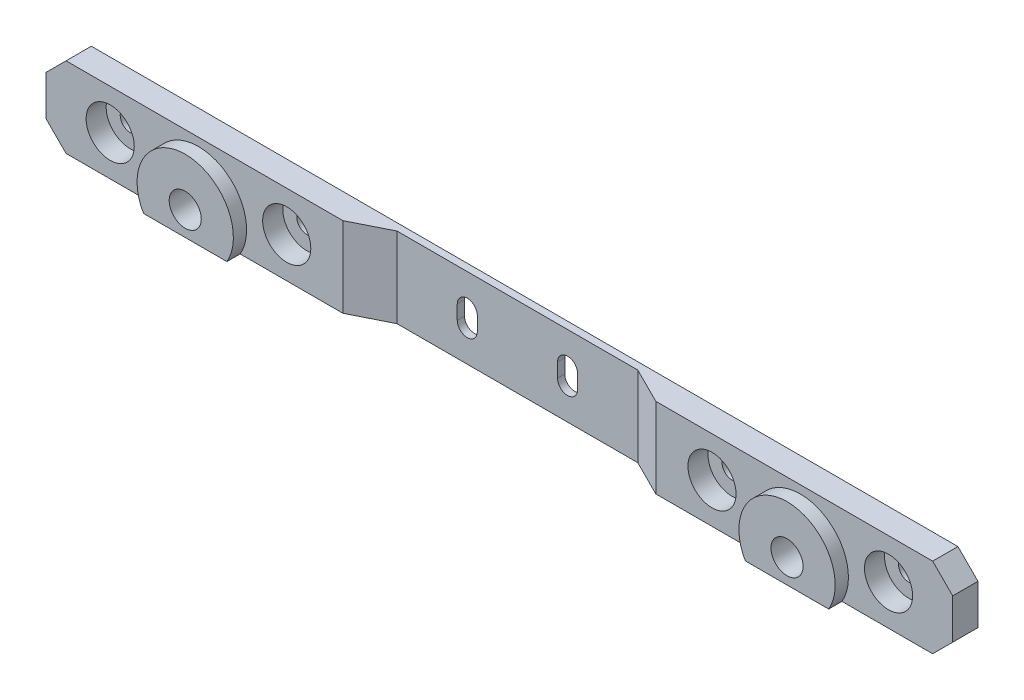
ISO-10303-21;
HEADER;
FILE_DESCRIPTION(('STEP AP214'),'2;1');
FILE_NAME('part.step','',(''),(''),'','','');
FILE_SCHEMA(('AUTOMOTIVE_DESIGN { 1 0 10303 214 1 1 1 1 }'));
ENDSEC;
DATA;
#1=APPLICATION_CONTEXT('core data for automotive mechanical design processes');
#2=APPLICATION_PROTOCOL_DEFINITION('international standard','automotive_design',2000,#1);
#3=PRODUCT_CONTEXT('',#1,'mechanical');
#4=PRODUCT('Part','Part','',(#3));
#5=PRODUCT_RELATED_PRODUCT_CATEGORY('part','',(#4));
#6=PRODUCT_DEFINITION_FORMATION('','',#4);
#7=PRODUCT_DEFINITION_CONTEXT('part definition',#1,'design');
#8=PRODUCT_DEFINITION('design','',#6,#7);
#9=PRODUCT_DEFINITION_SHAPE('','',#8);
#10=(LENGTH_UNIT() NAMED_UNIT(*) SI_UNIT(.MILLI.,.METRE.));
#11=(NAMED_UNIT(*) PLANE_ANGLE_UNIT() SI_UNIT($,.RADIAN.));
#12=(NAMED_UNIT(*) SI_UNIT($,.STERADIAN.) SOLID_ANGLE_UNIT());
#13=UNCERTAINTY_MEASURE_WITH_UNIT(LENGTH_MEASURE(1.E-05),#10,'distance_accuracy_value','');
#14=(GEOMETRIC_REPRESENTATION_CONTEXT(3) GLOBAL_UNCERTAINTY_ASSIGNED_CONTEXT((#13)) GLOBAL_UNIT_ASSIGNED_CONTEXT((#10,
#11,#12)) REPRESENTATION_CONTEXT('',''));
#15=CARTESIAN_POINT('',(0.,0.,0.));
#16=DIRECTION('',(0.,0.,1.));
#17=DIRECTION('',(1.,0.,0.));
#18=AXIS2_PLACEMENT_3D('',#15,#16,#17);
#19=CARTESIAN_POINT('',(166.,-10.,9.6));
#20=DIRECTION('',(0.,0.,-1.));
#21=DIRECTION('',(-1.,0.,0.));
#22=AXIS2_PLACEMENT_3D('',#19,#20,#21);
#23=CYLINDRICAL_SURFACE('',#22,2.5);
#24=CARTESIAN_POINT('',(166.,-10.,0.));
#25=DIRECTION('',(0.,0.,1.));
#26=DIRECTION('',(1.,0.,0.));
#27=AXIS2_PLACEMENT_3D('',#24,#25,#26);
#28=CIRCLE('',#27,2.5);
#29=CARTESIAN_POINT('',(168.5,-10.,0.));
#30=VERTEX_POINT('',#29);
#31=EDGE_CURVE('E426',#30,#30,#28,.F.);
#32=ORIENTED_EDGE('',*,*,#31,.T.);
#33=EDGE_LOOP('',(#32));
#34=FACE_BOUND('',#33,.T.);
#35=CARTESIAN_POINT('',(166.,-10.,1.3));
#36=DIRECTION('',(0.,0.,1.));
#37=DIRECTION('',(1.,0.,0.));
#38=AXIS2_PLACEMENT_3D('',#35,#36,#37);
#39=CIRCLE('',#38,2.5);
#40=CARTESIAN_POINT('',(168.5,-10.,1.3));
#41=VERTEX_POINT('',#40);
#42=EDGE_CURVE('E45',#41,#41,#39,.F.);
#43=ORIENTED_EDGE('',*,*,#42,.F.);
#44=EDGE_LOOP('',(#43));
#45=FACE_BOUND('',#44,.T.);
#46=ADVANCED_FACE('F41',(#34,#45),#23,.F.);
#47=CARTESIAN_POINT('',(60.,-10.,9.6));
#48=DIRECTION('',(0.,0.,-1.));
#49=DIRECTION('',(-1.,0.,0.));
#50=AXIS2_PLACEMENT_3D('',#47,#48,#49);
#51=CYLINDRICAL_SURFACE('',#50,2.5);
#52=CARTESIAN_POINT('',(60.,-10.,0.));
#53=DIRECTION('',(0.,0.,1.));
#54=DIRECTION('',(1.,0.,0.));
#55=AXIS2_PLACEMENT_3D('',#52,#53,#54);
#56=CIRCLE('',#55,2.5);
#57=CARTESIAN_POINT('',(62.5,-10.,0.));
#58=VERTEX_POINT('',#57);
#59=EDGE_CURVE('E422',#58,#58,#56,.T.);
#60=ORIENTED_EDGE('',*,*,#59,.F.);
#61=EDGE_LOOP('',(#60));
#62=FACE_BOUND('',#61,.T.);
#63=CARTESIAN_POINT('',(60.,-10.,1.3));
#64=DIRECTION('',(0.,0.,1.));
#65=DIRECTION('',(1.,0.,0.));
#66=AXIS2_PLACEMENT_3D('',#63,#64,#65);
#67=CIRCLE('',#66,2.5);
#68=CARTESIAN_POINT('',(62.5,-10.,1.3));
#69=VERTEX_POINT('',#68);
#70=EDGE_CURVE('E491',#69,#69,#67,.T.);
#71=ORIENTED_EDGE('',*,*,#70,.T.);
#72=EDGE_LOOP('',(#71));
#73=FACE_BOUND('',#72,.T.);
#74=ADVANCED_FACE('F503',(#62,#73),#51,.F.);
#75=CARTESIAN_POINT('',(16.,-10.,9.6));
#76=DIRECTION('',(0.,0.,-1.));
#77=DIRECTION('',(-1.,0.,0.));
#78=AXIS2_PLACEMENT_3D('',#75,#76,#77);
#79=CYLINDRICAL_SURFACE('',#78,2.5);
#80=CARTESIAN_POINT('',(16.,-10.,0.));
#81=DIRECTION('',(0.,0.,1.));
#82=DIRECTION('',(1.,0.,0.));
#83=AXIS2_PLACEMENT_3D('',#80,#81,#82);
#84=CIRCLE('',#83,2.5);
#85=CARTESIAN_POINT('',(18.5,-10.,0.));
#86=VERTEX_POINT('',#85);
#87=EDGE_CURVE('E418',#86,#86,#84,.T.);
#88=ORIENTED_EDGE('',*,*,#87,.F.);
#89=EDGE_LOOP('',(#88));
#90=FACE_BOUND('',#89,.T.);
#91=CARTESIAN_POINT('',(16.,-10.,1.3));
#92=DIRECTION('',(0.,0.,1.));
#93=DIRECTION('',(1.,0.,0.));
#94=AXIS2_PLACEMENT_3D('',#91,#92,#93);
#95=CIRCLE('',#94,2.5);
#96=CARTESIAN_POINT('',(18.5,-10.,1.3));
#97=VERTEX_POINT('',#96);
#98=EDGE_CURVE('E487',#97,#97,#95,.T.);
#99=ORIENTED_EDGE('',*,*,#98,.T.);
#100=EDGE_LOOP('',(#99));
#101=FACE_BOUND('',#100,.T.);
#102=ADVANCED_FACE('F509',(#90,#101),#79,.F.);
#103=CARTESIAN_POINT('',(210.,-10.,9.6));
#104=DIRECTION('',(0.,0.,-1.));
#105=DIRECTION('',(-1.,0.,0.));
#106=AXIS2_PLACEMENT_3D('',#103,#104,#105);
#107=CYLINDRICAL_SURFACE('',#106,2.5);
#108=CARTESIAN_POINT('',(210.,-10.,0.));
#109=DIRECTION('',(0.,0.,1.));
#110=DIRECTION('',(1.,0.,0.));
#111=AXIS2_PLACEMENT_3D('',#108,#109,#110);
#112=CIRCLE('',#111,2.5);
#113=CARTESIAN_POINT('',(212.5,-10.,0.));
#114=VERTEX_POINT('',#113);
#115=EDGE_CURVE('E382',#114,#114,#112,.F.);
#116=ORIENTED_EDGE('',*,*,#115,.T.);
#117=EDGE_LOOP('',(#116));
#118=FACE_BOUND('',#117,.T.);
#119=CARTESIAN_POINT('',(210.,-10.,1.3));
#120=DIRECTION('',(0.,0.,1.));
#121=DIRECTION('',(1.,0.,0.));
#122=AXIS2_PLACEMENT_3D('',#119,#120,#121);
#123=CIRCLE('',#122,2.5);
#124=CARTESIAN_POINT('',(212.5,-10.,1.3));
#125=VERTEX_POINT('',#124);
#126=EDGE_CURVE('E483',#125,#125,#123,.F.);
#127=ORIENTED_EDGE('',*,*,#126,.F.);
#128=EDGE_LOOP('',(#127));
#129=FACE_BOUND('',#128,.T.);
#130=ADVANCED_FACE('F518',(#118,#129),#107,.F.);
#131=CARTESIAN_POINT('',(0.,0.,6.3));
#132=DIRECTION('',(0.,0.,1.));
#133=DIRECTION('',(1.,0.,0.));
#134=AXIS2_PLACEMENT_3D('',#131,#132,#133);
#135=PLANE('',#134);
#136=CARTESIAN_POINT('',(166.,-10.,6.3));
#137=DIRECTION('',(0.,0.,1.));
#138=DIRECTION('',(1.,0.,0.));
#139=AXIS2_PLACEMENT_3D('',#136,#137,#138);
#140=CIRCLE('',#139,6.00000000000002);
#141=CARTESIAN_POINT('',(172.,-10.,6.3));
#142=VERTEX_POINT('',#141);
#143=EDGE_CURVE('E706',#142,#142,#140,.T.);
#144=ORIENTED_EDGE('',*,*,#143,.F.);
#145=EDGE_LOOP('',(#144));
#146=FACE_BOUND('',#145,.T.);
#147=CARTESIAN_POINT('',(210.,-10.,6.3));
#148=DIRECTION('',(0.,0.,1.));
#149=DIRECTION('',(1.,0.,0.));
#150=AXIS2_PLACEMENT_3D('',#147,#148,#149);
#151=CIRCLE('',#150,6.00000000000002);
#152=CARTESIAN_POINT('',(216.,-10.,6.3));
#153=VERTEX_POINT('',#152);
#154=EDGE_CURVE('E237',#153,#153,#151,.T.);
#155=ORIENTED_EDGE('',*,*,#154,.F.);
#156=EDGE_LOOP('',(#155));
#157=FACE_BOUND('',#156,.T.);
#158=DIRECTION('',(-1.,0.,0.));
#159=VECTOR('',#158,1.);
#160=CARTESIAN_POINT('',(0.,0.,6.3));
#161=LINE('',#160,#159);
#162=CARTESIAN_POINT('',(221.,0.,6.3));
#163=VERTEX_POINT('',#162);
#164=CARTESIAN_POINT('',(152.,0.,6.3));
#165=VERTEX_POINT('',#164);
#166=EDGE_CURVE('E300',#163,#165,#161,.T.);
#167=ORIENTED_EDGE('',*,*,#166,.T.);
#168=DIRECTION('',(0.,-1.,0.));
#169=VECTOR('',#168,1.);
#170=CARTESIAN_POINT('',(152.,0.,6.3));
#171=LINE('',#170,#169);
#172=CARTESIAN_POINT('',(152.,-20.,6.3));
#173=VERTEX_POINT('',#172);
#174=EDGE_CURVE('E209',#165,#173,#171,.T.);
#175=ORIENTED_EDGE('',*,*,#174,.T.);
#176=DIRECTION('',(1.,0.,0.));
#177=VECTOR('',#176,1.);
#178=CARTESIAN_POINT('',(0.,-20.,6.3));
#179=LINE('',#178,#177);
#180=CARTESIAN_POINT('',(177.607695154587,-20.,6.3));
#181=VERTEX_POINT('',#180);
#182=EDGE_CURVE('E282',#173,#181,#179,.T.);
#183=ORIENTED_EDGE('',*,*,#182,.T.);
#184=CARTESIAN_POINT('',(188.,-14.,6.3));
#185=DIRECTION('',(0.,0.,1.));
#186=DIRECTION('',(1.,0.,0.));
#187=AXIS2_PLACEMENT_3D('',#184,#185,#186);
#188=CIRCLE('',#187,12.);
#189=CARTESIAN_POINT('',(198.392304845413,-20.,6.3));
#190=VERTEX_POINT('',#189);
#191=EDGE_CURVE('E281',#181,#190,#188,.F.);
#192=ORIENTED_EDGE('',*,*,#191,.T.);
#193=DIRECTION('',(1.,0.,0.));
#194=VECTOR('',#193,1.);
#195=CARTESIAN_POINT('',(0.,-20.,6.3));
#196=LINE('',#195,#194);
#197=CARTESIAN_POINT('',(221.,-20.,6.3));
#198=VERTEX_POINT('',#197);
#199=EDGE_CURVE('E287',#190,#198,#196,.T.);
#200=ORIENTED_EDGE('',*,*,#199,.T.);
#201=DIRECTION('',(0.707106781186548,0.707106781186547,0.));
#202=VECTOR('',#201,1.);
#203=CARTESIAN_POINT('',(120.5,-120.5,6.3));
#204=LINE('',#203,#202);
#205=CARTESIAN_POINT('',(226.,-15.,6.3));
#206=VERTEX_POINT('',#205);
#207=EDGE_CURVE('E290',#198,#206,#204,.T.);
#208=ORIENTED_EDGE('',*,*,#207,.T.);
#209=DIRECTION('',(0.,1.,0.));
#210=VECTOR('',#209,1.);
#211=CARTESIAN_POINT('',(226.,0.,6.3));
#212=LINE('',#211,#210);
#213=CARTESIAN_POINT('',(226.,-5.00000000000004,6.3));
#214=VERTEX_POINT('',#213);
#215=EDGE_CURVE('E293',#206,#214,#212,.T.);
#216=ORIENTED_EDGE('',*,*,#215,.T.);
#217=DIRECTION('',(-0.707106781186548,0.707106781186547,0.));
#218=VECTOR('',#217,1.);
#219=CARTESIAN_POINT('',(110.5,110.5,6.3));
#220=LINE('',#219,#218);
#221=EDGE_CURVE('E296',#214,#163,#220,.T.);
#222=ORIENTED_EDGE('',*,*,#221,.T.);
#223=EDGE_LOOP('',(#167,#175,#183,#192,#200,#208,#216,#222));
#224=FACE_BOUND('',#223,.T.);
#225=ADVANCED_FACE('F552',(#146,#157,#224),#135,.T.);
#226=CARTESIAN_POINT('',(110.5,110.5,9.6));
#227=DIRECTION('',(0.707106781186547,0.707106781186548,0.));
#228=DIRECTION('',(-0.707106781186548,0.707106781186547,0.));
#229=AXIS2_PLACEMENT_3D('',#226,#227,#228);
#230=PLANE('',#229);
#231=DIRECTION('',(0.,0.,-1.));
#232=VECTOR('',#231,1.);
#233=CARTESIAN_POINT('',(221.,0.,9.6));
#234=LINE('',#233,#232);
#235=CARTESIAN_POINT('',(221.,0.,0.));
#236=VERTEX_POINT('',#235);
#237=EDGE_CURVE('E51',#163,#236,#234,.T.);
#238=ORIENTED_EDGE('',*,*,#237,.F.);
#239=ORIENTED_EDGE('',*,*,#221,.F.);
#240=DIRECTION('',(0.,0.,-1.));
#241=VECTOR('',#240,1.);
#242=CARTESIAN_POINT('',(226.,-5.00000000000004,9.6));
#243=LINE('',#242,#241);
#244=CARTESIAN_POINT('',(226.,-5.00000000000004,0.));
#245=VERTEX_POINT('',#244);
#246=EDGE_CURVE('E437',#214,#245,#243,.T.);
#247=ORIENTED_EDGE('',*,*,#246,.T.);
#248=DIRECTION('',(0.707106781186548,-0.707106781186547,0.));
#249=VECTOR('',#248,1.);
#250=CARTESIAN_POINT('',(110.5,110.5,0.));
#251=LINE('',#250,#249);
#252=EDGE_CURVE('E386',#236,#245,#251,.T.);
#253=ORIENTED_EDGE('',*,*,#252,.F.);
#254=EDGE_LOOP('',(#238,#239,#247,#253));
#255=FACE_BOUND('',#254,.T.);
#256=ADVANCED_FACE('F549',(#255),#230,.T.);
#257=CARTESIAN_POINT('',(0.,0.,9.6));
#258=DIRECTION('',(0.,1.,0.));
#259=DIRECTION('',(0.,0.,1.));
#260=AXIS2_PLACEMENT_3D('',#257,#258,#259);
#261=PLANE('',#260);
#262=DIRECTION('',(0.894427190999916,0.,-0.447213595499958));
#263=VECTOR('',#262,1.);
#264=CARTESIAN_POINT('',(17.32,0.,34.64));
#265=LINE('',#264,#263);
#266=CARTESIAN_POINT('',(74.,0.,6.3));
#267=VERTEX_POINT('',#266);
#268=CARTESIAN_POINT('',(83.,0.,1.79999999999998));
#269=VERTEX_POINT('',#268);
#270=EDGE_CURVE('E215',#267,#269,#265,.T.);
#271=ORIENTED_EDGE('',*,*,#270,.T.);
#272=DIRECTION('',(1.,0.,0.));
#273=VECTOR('',#272,1.);
#274=CARTESIAN_POINT('',(0.,0.,1.79999999999998));
#275=LINE('',#274,#273);
#276=CARTESIAN_POINT('',(143.,0.,1.79999999999998));
#277=VERTEX_POINT('',#276);
#278=EDGE_CURVE('E216',#269,#277,#275,.T.);
#279=ORIENTED_EDGE('',*,*,#278,.T.);
#280=DIRECTION('',(-0.894427190999914,0.,-0.447213595499961));
#281=VECTOR('',#280,1.);
#282=CARTESIAN_POINT('',(27.8800000000004,0.,-55.7600000000003));
#283=LINE('',#282,#281);
#284=EDGE_CURVE('E203',#165,#277,#283,.T.);
#285=ORIENTED_EDGE('',*,*,#284,.F.);
#286=ORIENTED_EDGE('',*,*,#166,.F.);
#287=ORIENTED_EDGE('',*,*,#237,.T.);
#288=DIRECTION('',(1.,0.,0.));
#289=VECTOR('',#288,1.);
#290=CARTESIAN_POINT('',(0.,0.,0.));
#291=LINE('',#290,#289);
#292=CARTESIAN_POINT('',(5.,0.,0.));
#293=VERTEX_POINT('',#292);
#294=EDGE_CURVE('E390',#293,#236,#291,.T.);
#295=ORIENTED_EDGE('',*,*,#294,.F.);
#296=DIRECTION('',(0.,0.,-1.));
#297=VECTOR('',#296,1.);
#298=CARTESIAN_POINT('',(5.,0.,9.6));
#299=LINE('',#298,#297);
#300=CARTESIAN_POINT('',(5.,0.,6.3));
#301=VERTEX_POINT('',#300);
#302=EDGE_CURVE('E456',#301,#293,#299,.T.);
#303=ORIENTED_EDGE('',*,*,#302,.F.);
#304=EDGE_CURVE('E299',#267,#301,#161,.T.);
#305=ORIENTED_EDGE('',*,*,#304,.F.);
#306=EDGE_LOOP('',(#271,#279,#285,#286,#287,#295,#303,#305));
#307=FACE_BOUND('',#306,.T.);
#308=ADVANCED_FACE('F227',(#307),#261,.T.);
#309=CARTESIAN_POINT('',(2.5,-2.5,9.6));
#310=DIRECTION('',(0.707106781186548,-0.707106781186548,0.));
#311=DIRECTION('',(0.707106781186548,0.707106781186548,0.));
#312=AXIS2_PLACEMENT_3D('',#309,#310,#311);
#313=PLANE('',#312);
#314=DIRECTION('',(-0.707106781186548,-0.707106781186548,0.));
#315=VECTOR('',#314,1.);
#316=CARTESIAN_POINT('',(2.5,-2.5,6.3));
#317=LINE('',#316,#315);
#318=CARTESIAN_POINT('',(0.,-5.,6.3));
#319=VERTEX_POINT('',#318);
#320=EDGE_CURVE('E303',#301,#319,#317,.T.);
#321=ORIENTED_EDGE('',*,*,#320,.F.);
#322=ORIENTED_EDGE('',*,*,#302,.T.);
#323=DIRECTION('',(-0.707106781186548,-0.707106781186548,0.));
#324=VECTOR('',#323,1.);
#325=CARTESIAN_POINT('',(2.5,-2.5,0.));
#326=LINE('',#325,#324);
#327=CARTESIAN_POINT('',(0.,-5.,0.));
#328=VERTEX_POINT('',#327);
#329=EDGE_CURVE('E394',#293,#328,#326,.T.);
#330=ORIENTED_EDGE('',*,*,#329,.T.);
#331=DIRECTION('',(0.,0.,-1.));
#332=VECTOR('',#331,1.);
#333=CARTESIAN_POINT('',(0.,-5.,9.6));
#334=LINE('',#333,#332);
#335=EDGE_CURVE('E453',#319,#328,#334,.T.);
#336=ORIENTED_EDGE('',*,*,#335,.F.);
#337=EDGE_LOOP('',(#321,#322,#330,#336));
#338=FACE_BOUND('',#337,.T.);
#339=ADVANCED_FACE('F542',(#338),#313,.F.);
#340=CARTESIAN_POINT('',(0.,0.,9.6));
#341=DIRECTION('',(1.,0.,0.));
#342=DIRECTION('',(0.,1.,0.));
#343=AXIS2_PLACEMENT_3D('',#340,#341,#342);
#344=PLANE('',#343);
#345=DIRECTION('',(0.,-1.,0.));
#346=VECTOR('',#345,1.);
#347=CARTESIAN_POINT('',(0.,0.,6.3));
#348=LINE('',#347,#346);
#349=CARTESIAN_POINT('',(0.,-15.,6.3));
#350=VERTEX_POINT('',#349);
#351=EDGE_CURVE('E306',#319,#350,#348,.T.);
#352=ORIENTED_EDGE('',*,*,#351,.F.);
#353=ORIENTED_EDGE('',*,*,#335,.T.);
#354=DIRECTION('',(0.,-1.,0.));
#355=VECTOR('',#354,1.);
#356=CARTESIAN_POINT('',(0.,0.,0.));
#357=LINE('',#356,#355);
#358=CARTESIAN_POINT('',(0.,-15.,0.));
#359=VERTEX_POINT('',#358);
#360=EDGE_CURVE('E398',#328,#359,#357,.T.);
#361=ORIENTED_EDGE('',*,*,#360,.T.);
#362=DIRECTION('',(0.,0.,-1.));
#363=VECTOR('',#362,1.);
#364=CARTESIAN_POINT('',(0.,-15.,9.6));
#365=LINE('',#364,#363);
#366=EDGE_CURVE('E450',#350,#359,#365,.T.);
#367=ORIENTED_EDGE('',*,*,#366,.F.);
#368=EDGE_LOOP('',(#352,#353,#361,#367));
#369=FACE_BOUND('',#368,.T.);
#370=ADVANCED_FACE('F538',(#369),#344,.F.);
#371=CARTESIAN_POINT('',(-7.5,-7.5,9.6));
#372=DIRECTION('',(0.707106781186548,0.707106781186548,0.));
#373=DIRECTION('',(-0.707106781186548,0.707106781186548,0.));
#374=AXIS2_PLACEMENT_3D('',#371,#372,#373);
#375=PLANE('',#374);
#376=DIRECTION('',(0.707106781186548,-0.707106781186548,0.));
#377=VECTOR('',#376,1.);
#378=CARTESIAN_POINT('',(-7.5,-7.5,6.3));
#379=LINE('',#378,#377);
#380=CARTESIAN_POINT('',(5.00000000000001,-20.,6.3));
#381=VERTEX_POINT('',#380);
#382=EDGE_CURVE('E309',#350,#381,#379,.T.);
#383=ORIENTED_EDGE('',*,*,#382,.F.);
#384=ORIENTED_EDGE('',*,*,#366,.T.);
#385=DIRECTION('',(0.707106781186548,-0.707106781186548,0.));
#386=VECTOR('',#385,1.);
#387=CARTESIAN_POINT('',(-7.5,-7.5,0.));
#388=LINE('',#387,#386);
#389=CARTESIAN_POINT('',(5.00000000000001,-20.,0.));
#390=VERTEX_POINT('',#389);
#391=EDGE_CURVE('E402',#359,#390,#388,.T.);
#392=ORIENTED_EDGE('',*,*,#391,.T.);
#393=DIRECTION('',(0.,0.,-1.));
#394=VECTOR('',#393,1.);
#395=CARTESIAN_POINT('',(5.00000000000001,-20.,9.6));
#396=LINE('',#395,#394);
#397=EDGE_CURVE('E447',#381,#390,#396,.T.);
#398=ORIENTED_EDGE('',*,*,#397,.F.);
#399=EDGE_LOOP('',(#383,#384,#392,#398));
#400=FACE_BOUND('',#399,.T.);
#401=ADVANCED_FACE('F534',(#400),#375,.F.);
#402=CARTESIAN_POINT('',(0.,-20.,9.6));
#403=DIRECTION('',(0.,1.,0.));
#404=DIRECTION('',(0.,0.,1.));
#405=AXIS2_PLACEMENT_3D('',#402,#403,#404);
#406=PLANE('',#405);
#407=DIRECTION('',(1.,0.,0.));
#408=VECTOR('',#407,1.);
#409=CARTESIAN_POINT('',(0.,-20.,1.79999999999998));
#410=LINE('',#409,#408);
#411=CARTESIAN_POINT('',(83.,-20.,1.79999999999998));
#412=VERTEX_POINT('',#411);
#413=CARTESIAN_POINT('',(143.,-20.,1.79999999999998));
#414=VERTEX_POINT('',#413);
#415=EDGE_CURVE('E223',#412,#414,#410,.T.);
#416=ORIENTED_EDGE('',*,*,#415,.F.);
#417=DIRECTION('',(0.894427190999916,0.,-0.447213595499958));
#418=VECTOR('',#417,1.);
#419=CARTESIAN_POINT('',(17.32,-20.,34.64));
#420=LINE('',#419,#418);
#421=CARTESIAN_POINT('',(74.,-20.,6.3));
#422=VERTEX_POINT('',#421);
#423=EDGE_CURVE('E230',#422,#412,#420,.T.);
#424=ORIENTED_EDGE('',*,*,#423,.F.);
#425=CARTESIAN_POINT('',(48.3923048454133,-20.,6.3));
#426=VERTEX_POINT('',#425);
#427=EDGE_CURVE('E277',#426,#422,#179,.T.);
#428=ORIENTED_EDGE('',*,*,#427,.F.);
#429=DIRECTION('',(0.,0.,1.));
#430=VECTOR('',#429,1.);
#431=CARTESIAN_POINT('',(48.3923048454133,-20.,6.3));
#432=LINE('',#431,#430);
#433=CARTESIAN_POINT('',(48.3923048454133,-20.,9.6));
#434=VERTEX_POINT('',#433);
#435=EDGE_CURVE('E322',#426,#434,#432,.T.);
#436=ORIENTED_EDGE('',*,*,#435,.T.);
#437=DIRECTION('',(1.,0.,0.));
#438=VECTOR('',#437,1.);
#439=CARTESIAN_POINT('',(0.,-20.,9.6));
#440=LINE('',#439,#438);
#441=CARTESIAN_POINT('',(27.6076951545867,-20.,9.6));
#442=VERTEX_POINT('',#441);
#443=EDGE_CURVE('E340',#442,#434,#440,.T.);
#444=ORIENTED_EDGE('',*,*,#443,.F.);
#445=DIRECTION('',(0.,0.,1.));
#446=VECTOR('',#445,1.);
#447=CARTESIAN_POINT('',(27.6076951545867,-20.,6.3));
#448=LINE('',#447,#446);
#449=CARTESIAN_POINT('',(27.6076951545867,-20.,6.3));
#450=VERTEX_POINT('',#449);
#451=EDGE_CURVE('E327',#450,#442,#448,.T.);
#452=ORIENTED_EDGE('',*,*,#451,.F.);
#453=EDGE_CURVE('E283',#381,#450,#179,.T.);
#454=ORIENTED_EDGE('',*,*,#453,.F.);
#455=ORIENTED_EDGE('',*,*,#397,.T.);
#456=DIRECTION('',(1.,0.,0.));
#457=VECTOR('',#456,1.);
#458=CARTESIAN_POINT('',(0.,-20.,0.));
#459=LINE('',#458,#457);
#460=CARTESIAN_POINT('',(221.,-20.,0.));
#461=VERTEX_POINT('',#460);
#462=EDGE_CURVE('E406',#390,#461,#459,.T.);
#463=ORIENTED_EDGE('',*,*,#462,.T.);
#464=DIRECTION('',(0.,0.,-1.));
#465=VECTOR('',#464,1.);
#466=CARTESIAN_POINT('',(221.,-20.,9.6));
#467=LINE('',#466,#465);
#468=EDGE_CURVE('E444',#198,#461,#467,.T.);
#469=ORIENTED_EDGE('',*,*,#468,.F.);
#470=ORIENTED_EDGE('',*,*,#199,.F.);
#471=DIRECTION('',(0.,0.,1.));
#472=VECTOR('',#471,1.);
#473=CARTESIAN_POINT('',(198.392304845413,-20.,6.3));
#474=LINE('',#473,#472);
#475=CARTESIAN_POINT('',(198.392304845413,-20.,9.6));
#476=VERTEX_POINT('',#475);
#477=EDGE_CURVE('E330',#190,#476,#474,.T.);
#478=ORIENTED_EDGE('',*,*,#477,.T.);
#479=CARTESIAN_POINT('',(177.607695154587,-20.,9.6));
#480=VERTEX_POINT('',#479);
#481=EDGE_CURVE('E336',#480,#476,#440,.T.);
#482=ORIENTED_EDGE('',*,*,#481,.F.);
#483=DIRECTION('',(0.,0.,1.));
#484=VECTOR('',#483,1.);
#485=CARTESIAN_POINT('',(177.607695154587,-20.,6.3));
#486=LINE('',#485,#484);
#487=EDGE_CURVE('E315',#181,#480,#486,.T.);
#488=ORIENTED_EDGE('',*,*,#487,.F.);
#489=ORIENTED_EDGE('',*,*,#182,.F.);
#490=DIRECTION('',(-0.894427190999914,0.,-0.447213595499961));
#491=VECTOR('',#490,1.);
#492=CARTESIAN_POINT('',(27.8800000000004,-20.,-55.7600000000003));
#493=LINE('',#492,#491);
#494=EDGE_CURVE('E234',#173,#414,#493,.T.);
#495=ORIENTED_EDGE('',*,*,#494,.T.);
#496=EDGE_LOOP('',(#416,#424,#428,#436,#444,#452,#454,#455,#463,#469,#470,#478,#482,#488,#489,#495));
#497=FACE_BOUND('',#496,.T.);
#498=ADVANCED_FACE('F530',(#497),#406,.F.);
#499=CARTESIAN_POINT('',(120.5,-120.5,9.6));
#500=DIRECTION('',(0.707106781186547,-0.707106781186548,0.));
#501=DIRECTION('',(0.707106781186548,0.707106781186547,0.));
#502=AXIS2_PLACEMENT_3D('',#499,#500,#501);
#503=PLANE('',#502);
#504=DIRECTION('',(0.,0.,-1.));
#505=VECTOR('',#504,1.);
#506=CARTESIAN_POINT('',(226.,-15.,9.6));
#507=LINE('',#506,#505);
#508=CARTESIAN_POINT('',(226.,-15.,0.));
#509=VERTEX_POINT('',#508);
#510=EDGE_CURVE('E440',#206,#509,#507,.T.);
#511=ORIENTED_EDGE('',*,*,#510,.F.);
#512=ORIENTED_EDGE('',*,*,#207,.F.);
#513=ORIENTED_EDGE('',*,*,#468,.T.);
#514=DIRECTION('',(-0.707106781186548,-0.707106781186547,0.));
#515=VECTOR('',#514,1.);
#516=CARTESIAN_POINT('',(120.5,-120.5,0.));
#517=LINE('',#516,#515);
#518=EDGE_CURVE('E410',#509,#461,#517,.T.);
#519=ORIENTED_EDGE('',*,*,#518,.F.);
#520=EDGE_LOOP('',(#511,#512,#513,#519));
#521=FACE_BOUND('',#520,.T.);
#522=ADVANCED_FACE('F526',(#521),#503,.T.);
#523=CARTESIAN_POINT('',(125.5,-8.25,9.6));
#524=DIRECTION('',(0.,0.,-1.));
#525=DIRECTION('',(-1.,0.,0.));
#526=AXIS2_PLACEMENT_3D('',#523,#524,#525);
#527=CYLINDRICAL_SURFACE('',#526,2.5);
#528=DIRECTION('',(0.,0.,-1.));
#529=VECTOR('',#528,1.);
#530=CARTESIAN_POINT('',(128.,-8.25,9.6));
#531=LINE('',#530,#529);
#532=CARTESIAN_POINT('',(128.,-8.25,1.79999999999998));
#533=VERTEX_POINT('',#532);
#534=CARTESIAN_POINT('',(128.,-8.25,0.));
#535=VERTEX_POINT('',#534);
#536=EDGE_CURVE('E441',#533,#535,#531,.T.);
#537=ORIENTED_EDGE('',*,*,#536,.F.);
#538=CARTESIAN_POINT('',(125.5,-8.25,1.79999999999998));
#539=DIRECTION('',(0.,0.,-1.));
#540=DIRECTION('',(-1.,0.,0.));
#541=AXIS2_PLACEMENT_3D('',#538,#539,#540);
#542=CIRCLE('',#541,2.5);
#543=CARTESIAN_POINT('',(123.,-8.25,1.79999999999998));
#544=VERTEX_POINT('',#543);
#545=EDGE_CURVE('E272',#533,#544,#542,.F.);
#546=ORIENTED_EDGE('',*,*,#545,.T.);
#547=DIRECTION('',(0.,0.,-1.));
#548=VECTOR('',#547,1.);
#549=CARTESIAN_POINT('',(123.,-8.25,9.6));
#550=LINE('',#549,#548);
#551=CARTESIAN_POINT('',(123.,-8.25,0.));
#552=VERTEX_POINT('',#551);
#553=EDGE_CURVE('E461',#544,#552,#550,.T.);
#554=ORIENTED_EDGE('',*,*,#553,.T.);
#555=CARTESIAN_POINT('',(125.5,-8.25,0.));
#556=DIRECTION('',(0.,0.,1.));
#557=DIRECTION('',(1.,0.,0.));
#558=AXIS2_PLACEMENT_3D('',#555,#556,#557);
#559=CIRCLE('',#558,2.5);
#560=EDGE_CURVE('E366',#552,#535,#559,.F.);
#561=ORIENTED_EDGE('',*,*,#560,.T.);
#562=EDGE_LOOP('',(#537,#546,#554,#561));
#563=FACE_BOUND('',#562,.T.);
#564=ADVANCED_FACE('F529',(#563),#527,.F.);
#565=CARTESIAN_POINT('',(128.,0.,9.6));
#566=DIRECTION('',(1.,0.,0.));
#567=DIRECTION('',(0.,0.,-1.));
#568=AXIS2_PLACEMENT_3D('',#565,#566,#567);
#569=PLANE('',#568);
#570=DIRECTION('',(0.,0.,-1.));
#571=VECTOR('',#570,1.);
#572=CARTESIAN_POINT('',(128.,-11.75,9.6));
#573=LINE('',#572,#571);
#574=CARTESIAN_POINT('',(128.,-11.75,1.79999999999998));
#575=VERTEX_POINT('',#574);
#576=CARTESIAN_POINT('',(128.,-11.75,0.));
#577=VERTEX_POINT('',#576);
#578=EDGE_CURVE('E468',#575,#577,#573,.T.);
#579=ORIENTED_EDGE('',*,*,#578,.F.);
#580=DIRECTION('',(0.,1.,0.));
#581=VECTOR('',#580,1.);
#582=CARTESIAN_POINT('',(128.,0.,1.79999999999998));
#583=LINE('',#582,#581);
#584=EDGE_CURVE('E268',#575,#533,#583,.T.);
#585=ORIENTED_EDGE('',*,*,#584,.T.);
#586=ORIENTED_EDGE('',*,*,#536,.T.);
#587=DIRECTION('',(0.,-1.,0.));
#588=VECTOR('',#587,1.);
#589=CARTESIAN_POINT('',(128.,0.,0.));
#590=LINE('',#589,#588);
#591=EDGE_CURVE('E370',#535,#577,#590,.T.);
#592=ORIENTED_EDGE('',*,*,#591,.T.);
#593=EDGE_LOOP('',(#579,#585,#586,#592));
#594=FACE_BOUND('',#593,.T.);
#595=ADVANCED_FACE('F564',(#594),#569,.F.);
#596=CARTESIAN_POINT('',(125.5,-11.75,9.6));
#597=DIRECTION('',(0.,0.,-1.));
#598=DIRECTION('',(-1.,0.,0.));
#599=AXIS2_PLACEMENT_3D('',#596,#597,#598);
#600=CYLINDRICAL_SURFACE('',#599,2.5);
#601=DIRECTION('',(0.,0.,-1.));
#602=VECTOR('',#601,1.);
#603=CARTESIAN_POINT('',(123.,-11.75,9.6));
#604=LINE('',#603,#602);
#605=CARTESIAN_POINT('',(123.,-11.75,1.79999999999998));
#606=VERTEX_POINT('',#605);
#607=CARTESIAN_POINT('',(123.,-11.75,0.));
#608=VERTEX_POINT('',#607);
#609=EDGE_CURVE('E464',#606,#608,#604,.T.);
#610=ORIENTED_EDGE('',*,*,#609,.F.);
#611=CARTESIAN_POINT('',(125.5,-11.75,1.79999999999998));
#612=DIRECTION('',(0.,0.,-1.));
#613=DIRECTION('',(-1.,0.,0.));
#614=AXIS2_PLACEMENT_3D('',#611,#612,#613);
#615=CIRCLE('',#614,2.5);
#616=EDGE_CURVE('E59',#606,#575,#615,.F.);
#617=ORIENTED_EDGE('',*,*,#616,.T.);
#618=ORIENTED_EDGE('',*,*,#578,.T.);
#619=CARTESIAN_POINT('',(125.5,-11.75,0.));
#620=DIRECTION('',(0.,0.,1.));
#621=DIRECTION('',(1.,0.,0.));
#622=AXIS2_PLACEMENT_3D('',#619,#620,#621);
#623=CIRCLE('',#622,2.5);
#624=EDGE_CURVE('E374',#577,#608,#623,.F.);
#625=ORIENTED_EDGE('',*,*,#624,.T.);
#626=EDGE_LOOP('',(#610,#617,#618,#625));
#627=FACE_BOUND('',#626,.T.);
#628=ADVANCED_FACE('F561',(#627),#600,.F.);
#629=CARTESIAN_POINT('',(100.5,-8.25,9.6));
#630=DIRECTION('',(0.,0.,-1.));
#631=DIRECTION('',(-1.,0.,0.));
#632=AXIS2_PLACEMENT_3D('',#629,#630,#631);
#633=CYLINDRICAL_SURFACE('',#632,2.5);
#634=CARTESIAN_POINT('',(100.5,-8.25,1.79999999999998));
#635=DIRECTION('',(0.,0.,-1.));
#636=DIRECTION('',(-1.,0.,0.));
#637=AXIS2_PLACEMENT_3D('',#634,#635,#636);
#638=CIRCLE('',#637,2.5);
#639=CARTESIAN_POINT('',(98.,-8.25,1.79999999999998));
#640=VERTEX_POINT('',#639);
#641=CARTESIAN_POINT('',(103.,-8.25,1.79999999999998));
#642=VERTEX_POINT('',#641);
#643=EDGE_CURVE('E260',#640,#642,#638,.T.);
#644=ORIENTED_EDGE('',*,*,#643,.F.);
#645=DIRECTION('',(0.,0.,-1.));
#646=VECTOR('',#645,1.);
#647=CARTESIAN_POINT('',(98.,-8.25,9.6));
#648=LINE('',#647,#646);
#649=CARTESIAN_POINT('',(98.,-8.25,0.));
#650=VERTEX_POINT('',#649);
#651=EDGE_CURVE('E350',#640,#650,#648,.T.);
#652=ORIENTED_EDGE('',*,*,#651,.T.);
#653=CARTESIAN_POINT('',(100.5,-8.25,0.));
#654=DIRECTION('',(0.,0.,1.));
#655=DIRECTION('',(1.,0.,0.));
#656=AXIS2_PLACEMENT_3D('',#653,#654,#655);
#657=CIRCLE('',#656,2.5);
#658=CARTESIAN_POINT('',(103.,-8.25,0.));
#659=VERTEX_POINT('',#658);
#660=EDGE_CURVE('E326',#659,#650,#657,.T.);
#661=ORIENTED_EDGE('',*,*,#660,.F.);
#662=DIRECTION('',(0.,0.,-1.));
#663=VECTOR('',#662,1.);
#664=CARTESIAN_POINT('',(103.,-8.25,9.6));
#665=LINE('',#664,#663);
#666=EDGE_CURVE('E465',#642,#659,#665,.T.);
#667=ORIENTED_EDGE('',*,*,#666,.F.);
#668=EDGE_LOOP('',(#644,#652,#661,#667));
#669=FACE_BOUND('',#668,.T.);
#670=ADVANCED_FACE('F43',(#669),#633,.F.);
#671=CARTESIAN_POINT('',(103.,0.,9.6));
#672=DIRECTION('',(1.,0.,0.));
#673=DIRECTION('',(0.,0.,-1.));
#674=AXIS2_PLACEMENT_3D('',#671,#672,#673);
#675=PLANE('',#674);
#676=DIRECTION('',(0.,0.,-1.));
#677=VECTOR('',#676,1.);
#678=CARTESIAN_POINT('',(103.,-11.75,9.6));
#679=LINE('',#678,#677);
#680=CARTESIAN_POINT('',(103.,-11.75,1.79999999999998));
#681=VERTEX_POINT('',#680);
#682=CARTESIAN_POINT('',(103.,-11.75,0.));
#683=VERTEX_POINT('',#682);
#684=EDGE_CURVE('E478',#681,#683,#679,.T.);
#685=ORIENTED_EDGE('',*,*,#684,.F.);
#686=DIRECTION('',(0.,1.,0.));
#687=VECTOR('',#686,1.);
#688=CARTESIAN_POINT('',(103.,0.,1.79999999999998));
#689=LINE('',#688,#687);
#690=EDGE_CURVE('E256',#681,#642,#689,.T.);
#691=ORIENTED_EDGE('',*,*,#690,.T.);
#692=ORIENTED_EDGE('',*,*,#666,.T.);
#693=DIRECTION('',(0.,-1.,0.));
#694=VECTOR('',#693,1.);
#695=CARTESIAN_POINT('',(103.,0.,0.));
#696=LINE('',#695,#694);
#697=EDGE_CURVE('E354',#659,#683,#696,.T.);
#698=ORIENTED_EDGE('',*,*,#697,.T.);
#699=EDGE_LOOP('',(#685,#691,#692,#698));
#700=FACE_BOUND('',#699,.T.);
#701=ADVANCED_FACE('F577',(#700),#675,.F.);
#702=CARTESIAN_POINT('',(100.5,-11.75,9.6));
#703=DIRECTION('',(0.,0.,-1.));
#704=DIRECTION('',(-1.,0.,0.));
#705=AXIS2_PLACEMENT_3D('',#702,#703,#704);
#706=CYLINDRICAL_SURFACE('',#705,2.5);
#707=CARTESIAN_POINT('',(100.5,-11.75,1.79999999999998));
#708=DIRECTION('',(0.,0.,-1.));
#709=DIRECTION('',(-1.,0.,0.));
#710=AXIS2_PLACEMENT_3D('',#707,#708,#709);
#711=CIRCLE('',#710,2.5);
#712=CARTESIAN_POINT('',(98.,-11.75,1.79999999999998));
#713=VERTEX_POINT('',#712);
#714=EDGE_CURVE('E66',#681,#713,#711,.T.);
#715=ORIENTED_EDGE('',*,*,#714,.F.);
#716=ORIENTED_EDGE('',*,*,#684,.T.);
#717=CARTESIAN_POINT('',(100.5,-11.75,0.));
#718=DIRECTION('',(0.,0.,1.));
#719=DIRECTION('',(1.,0.,0.));
#720=AXIS2_PLACEMENT_3D('',#717,#718,#719);
#721=CIRCLE('',#720,2.5);
#722=CARTESIAN_POINT('',(98.,-11.75,0.));
#723=VERTEX_POINT('',#722);
#724=EDGE_CURVE('E358',#723,#683,#721,.T.);
#725=ORIENTED_EDGE('',*,*,#724,.F.);
#726=DIRECTION('',(0.,0.,-1.));
#727=VECTOR('',#726,1.);
#728=CARTESIAN_POINT('',(98.,-11.75,9.6));
#729=LINE('',#728,#727);
#730=EDGE_CURVE('E475',#713,#723,#729,.T.);
#731=ORIENTED_EDGE('',*,*,#730,.F.);
#732=EDGE_LOOP('',(#715,#716,#725,#731));
#733=FACE_BOUND('',#732,.T.);
#734=ADVANCED_FACE('F524',(#733),#706,.F.);
#735=CARTESIAN_POINT('',(226.,0.,9.6));
#736=DIRECTION('',(1.,0.,0.));
#737=DIRECTION('',(0.,0.,-1.));
#738=AXIS2_PLACEMENT_3D('',#735,#736,#737);
#739=PLANE('',#738);
#740=ORIENTED_EDGE('',*,*,#246,.F.);
#741=ORIENTED_EDGE('',*,*,#215,.F.);
#742=ORIENTED_EDGE('',*,*,#510,.T.);
#743=DIRECTION('',(0.,-1.,0.));
#744=VECTOR('',#743,1.);
#745=CARTESIAN_POINT('',(226.,0.,0.));
#746=LINE('',#745,#744);
#747=EDGE_CURVE('E414',#245,#509,#746,.T.);
#748=ORIENTED_EDGE('',*,*,#747,.F.);
#749=EDGE_LOOP('',(#740,#741,#742,#748));
#750=FACE_BOUND('',#749,.T.);
#751=ADVANCED_FACE('F520',(#750),#739,.T.);
#752=CARTESIAN_POINT('',(123.,0.,9.6));
#753=DIRECTION('',(1.,0.,0.));
#754=DIRECTION('',(0.,0.,-1.));
#755=AXIS2_PLACEMENT_3D('',#752,#753,#754);
#756=PLANE('',#755);
#757=DIRECTION('',(0.,1.,0.));
#758=VECTOR('',#757,1.);
#759=CARTESIAN_POINT('',(123.,0.,1.79999999999998));
#760=LINE('',#759,#758);
#761=EDGE_CURVE('E263',#606,#544,#760,.T.);
#762=ORIENTED_EDGE('',*,*,#761,.F.);
#763=ORIENTED_EDGE('',*,*,#609,.T.);
#764=DIRECTION('',(0.,-1.,0.));
#765=VECTOR('',#764,1.);
#766=CARTESIAN_POINT('',(123.,0.,0.));
#767=LINE('',#766,#765);
#768=EDGE_CURVE('E378',#552,#608,#767,.T.);
#769=ORIENTED_EDGE('',*,*,#768,.F.);
#770=ORIENTED_EDGE('',*,*,#553,.F.);
#771=EDGE_LOOP('',(#762,#763,#769,#770));
#772=FACE_BOUND('',#771,.T.);
#773=ADVANCED_FACE('F523',(#772),#756,.T.);
#774=CARTESIAN_POINT('',(98.,0.,9.6));
#775=DIRECTION('',(1.,0.,0.));
#776=DIRECTION('',(0.,0.,-1.));
#777=AXIS2_PLACEMENT_3D('',#774,#775,#776);
#778=PLANE('',#777);
#779=DIRECTION('',(0.,1.,0.));
#780=VECTOR('',#779,1.);
#781=CARTESIAN_POINT('',(98.,0.,1.79999999999998));
#782=LINE('',#781,#780);
#783=EDGE_CURVE('E11',#713,#640,#782,.T.);
#784=ORIENTED_EDGE('',*,*,#783,.F.);
#785=ORIENTED_EDGE('',*,*,#730,.T.);
#786=DIRECTION('',(0.,-1.,0.));
#787=VECTOR('',#786,1.);
#788=CARTESIAN_POINT('',(98.,0.,0.));
#789=LINE('',#788,#787);
#790=EDGE_CURVE('E362',#650,#723,#789,.T.);
#791=ORIENTED_EDGE('',*,*,#790,.F.);
#792=ORIENTED_EDGE('',*,*,#651,.F.);
#793=EDGE_LOOP('',(#784,#785,#791,#792));
#794=FACE_BOUND('',#793,.T.);
#795=ADVANCED_FACE('F559',(#794),#778,.T.);
#796=CARTESIAN_POINT('',(0.,0.,9.6));
#797=DIRECTION('',(0.,0.,1.));
#798=DIRECTION('',(1.,0.,0.));
#799=AXIS2_PLACEMENT_3D('',#796,#797,#798);
#800=PLANE('',#799);
#801=CARTESIAN_POINT('',(38.,-14.,9.6));
#802=DIRECTION('',(0.,0.,1.));
#803=DIRECTION('',(1.,0.,0.));
#804=AXIS2_PLACEMENT_3D('',#801,#802,#803);
#805=CIRCLE('',#804,4.);
#806=CARTESIAN_POINT('',(42.,-14.,9.6));
#807=VERTEX_POINT('',#806);
#808=EDGE_CURVE('E342',#807,#807,#805,.T.);
#809=ORIENTED_EDGE('',*,*,#808,.F.);
#810=EDGE_LOOP('',(#809));
#811=FACE_BOUND('',#810,.T.);
#812=ORIENTED_EDGE('',*,*,#443,.T.);
#813=CARTESIAN_POINT('',(38.,-14.,9.6));
#814=DIRECTION('',(0.,0.,1.));
#815=DIRECTION('',(1.,0.,0.));
#816=AXIS2_PLACEMENT_3D('',#813,#814,#815);
#817=CIRCLE('',#816,12.);
#818=EDGE_CURVE('E318',#434,#442,#817,.T.);
#819=ORIENTED_EDGE('',*,*,#818,.T.);
#820=EDGE_LOOP('',(#812,#819));
#821=FACE_BOUND('',#820,.T.);
#822=ADVANCED_FACE('F574',(#811,#821),#800,.T.);
#823=CARTESIAN_POINT('',(38.,-14.,9.6));
#824=DIRECTION('',(0.,0.,-1.));
#825=DIRECTION('',(-1.,0.,0.));
#826=AXIS2_PLACEMENT_3D('',#823,#824,#825);
#827=CYLINDRICAL_SURFACE('',#826,4.);
#828=ORIENTED_EDGE('',*,*,#808,.T.);
#829=EDGE_LOOP('',(#828));
#830=FACE_BOUND('',#829,.T.);
#831=CARTESIAN_POINT('',(38.,-14.,0.));
#832=DIRECTION('',(0.,0.,1.));
#833=DIRECTION('',(1.,0.,0.));
#834=AXIS2_PLACEMENT_3D('',#831,#832,#833);
#835=CIRCLE('',#834,4.);
#836=CARTESIAN_POINT('',(42.,-14.,0.));
#837=VERTEX_POINT('',#836);
#838=EDGE_CURVE('E430',#837,#837,#835,.T.);
#839=ORIENTED_EDGE('',*,*,#838,.F.);
#840=EDGE_LOOP('',(#839));
#841=FACE_BOUND('',#840,.T.);
#842=ADVANCED_FACE('F513',(#830,#841),#827,.F.);
#843=CARTESIAN_POINT('',(188.,-14.,9.6));
#844=DIRECTION('',(0.,0.,-1.));
#845=DIRECTION('',(-1.,0.,0.));
#846=AXIS2_PLACEMENT_3D('',#843,#844,#845);
#847=CYLINDRICAL_SURFACE('',#846,4.00000000000002);
#848=CARTESIAN_POINT('',(188.,-14.,9.6));
#849=DIRECTION('',(0.,0.,1.));
#850=DIRECTION('',(1.,0.,0.));
#851=AXIS2_PLACEMENT_3D('',#848,#849,#850);
#852=CIRCLE('',#851,4.00000000000002);
#853=CARTESIAN_POINT('',(192.,-14.,9.6));
#854=VERTEX_POINT('',#853);
#855=EDGE_CURVE('E346',#854,#854,#852,.F.);
#856=ORIENTED_EDGE('',*,*,#855,.F.);
#857=EDGE_LOOP('',(#856));
#858=FACE_BOUND('',#857,.T.);
#859=CARTESIAN_POINT('',(188.,-14.,0.));
#860=DIRECTION('',(0.,0.,1.));
#861=DIRECTION('',(1.,0.,0.));
#862=AXIS2_PLACEMENT_3D('',#859,#860,#861);
#863=CIRCLE('',#862,4.00000000000002);
#864=CARTESIAN_POINT('',(192.,-14.,0.));
#865=VERTEX_POINT('',#864);
#866=EDGE_CURVE('E341',#865,#865,#863,.F.);
#867=ORIENTED_EDGE('',*,*,#866,.T.);
#868=EDGE_LOOP('',(#867));
#869=FACE_BOUND('',#868,.T.);
#870=ADVANCED_FACE('F620',(#858,#869),#847,.F.);
#871=CARTESIAN_POINT('',(188.,-14.,9.6));
#872=DIRECTION('',(0.,0.,1.));
#873=DIRECTION('',(1.,0.,0.));
#874=AXIS2_PLACEMENT_3D('',#871,#872,#873);
#875=CIRCLE('',#874,12.);
#876=EDGE_CURVE('E276',#480,#476,#875,.F.);
#877=ORIENTED_EDGE('',*,*,#876,.F.);
#878=ORIENTED_EDGE('',*,*,#481,.T.);
#879=EDGE_LOOP('',(#877,#878));
#880=FACE_BOUND('',#879,.T.);
#881=ORIENTED_EDGE('',*,*,#855,.T.);
#882=EDGE_LOOP('',(#881));
#883=FACE_BOUND('',#882,.T.);
#884=ADVANCED_FACE('F599',(#880,#883),#800,.T.);
#885=CARTESIAN_POINT('',(0.,0.,0.));
#886=DIRECTION('',(0.,0.,1.));
#887=DIRECTION('',(1.,0.,0.));
#888=AXIS2_PLACEMENT_3D('',#885,#886,#887);
#889=PLANE('',#888);
#890=ORIENTED_EDGE('',*,*,#660,.T.);
#891=ORIENTED_EDGE('',*,*,#790,.T.);
#892=ORIENTED_EDGE('',*,*,#724,.T.);
#893=ORIENTED_EDGE('',*,*,#697,.F.);
#894=EDGE_LOOP('',(#890,#891,#892,#893));
#895=FACE_BOUND('',#894,.T.);
#896=ORIENTED_EDGE('',*,*,#560,.F.);
#897=ORIENTED_EDGE('',*,*,#768,.T.);
#898=ORIENTED_EDGE('',*,*,#624,.F.);
#899=ORIENTED_EDGE('',*,*,#591,.F.);
#900=EDGE_LOOP('',(#896,#897,#898,#899));
#901=FACE_BOUND('',#900,.T.);
#902=ORIENTED_EDGE('',*,*,#115,.F.);
#903=EDGE_LOOP('',(#902));
#904=FACE_BOUND('',#903,.T.);
#905=ORIENTED_EDGE('',*,*,#252,.T.);
#906=ORIENTED_EDGE('',*,*,#747,.T.);
#907=ORIENTED_EDGE('',*,*,#518,.T.);
#908=ORIENTED_EDGE('',*,*,#462,.F.);
#909=ORIENTED_EDGE('',*,*,#391,.F.);
#910=ORIENTED_EDGE('',*,*,#360,.F.);
#911=ORIENTED_EDGE('',*,*,#329,.F.);
#912=ORIENTED_EDGE('',*,*,#294,.T.);
#913=EDGE_LOOP('',(#905,#906,#907,#908,#909,#910,#911,#912));
#914=FACE_BOUND('',#913,.T.);
#915=ORIENTED_EDGE('',*,*,#87,.T.);
#916=EDGE_LOOP('',(#915));
#917=FACE_BOUND('',#916,.T.);
#918=ORIENTED_EDGE('',*,*,#59,.T.);
#919=EDGE_LOOP('',(#918));
#920=FACE_BOUND('',#919,.T.);
#921=ORIENTED_EDGE('',*,*,#31,.F.);
#922=EDGE_LOOP('',(#921));
#923=FACE_BOUND('',#922,.T.);
#924=ORIENTED_EDGE('',*,*,#838,.T.);
#925=EDGE_LOOP('',(#924));
#926=FACE_BOUND('',#925,.T.);
#927=ORIENTED_EDGE('',*,*,#866,.F.);
#928=EDGE_LOOP('',(#927));
#929=FACE_BOUND('',#928,.T.);
#930=ADVANCED_FACE('F595',(#895,#901,#904,#914,#917,#920,#923,#926,#929),#889,.F.);
#931=CARTESIAN_POINT('',(38.,-14.,6.3));
#932=DIRECTION('',(0.,0.,1.));
#933=DIRECTION('',(1.,0.,0.));
#934=AXIS2_PLACEMENT_3D('',#931,#932,#933);
#935=CYLINDRICAL_SURFACE('',#934,12.);
#936=ORIENTED_EDGE('',*,*,#818,.F.);
#937=ORIENTED_EDGE('',*,*,#435,.F.);
#938=CARTESIAN_POINT('',(38.,-14.,6.3));
#939=DIRECTION('',(0.,0.,1.));
#940=DIRECTION('',(1.,0.,0.));
#941=AXIS2_PLACEMENT_3D('',#938,#939,#940);
#942=CIRCLE('',#941,12.);
#943=EDGE_CURVE('E312',#426,#450,#942,.T.);
#944=ORIENTED_EDGE('',*,*,#943,.T.);
#945=ORIENTED_EDGE('',*,*,#451,.T.);
#946=EDGE_LOOP('',(#936,#937,#944,#945));
#947=FACE_BOUND('',#946,.T.);
#948=ADVANCED_FACE('F598',(#947),#935,.T.);
#949=CARTESIAN_POINT('',(188.,-14.,6.3));
#950=DIRECTION('',(0.,0.,1.));
#951=DIRECTION('',(1.,0.,0.));
#952=AXIS2_PLACEMENT_3D('',#949,#950,#951);
#953=CYLINDRICAL_SURFACE('',#952,12.);
#954=ORIENTED_EDGE('',*,*,#876,.T.);
#955=ORIENTED_EDGE('',*,*,#477,.F.);
#956=ORIENTED_EDGE('',*,*,#191,.F.);
#957=ORIENTED_EDGE('',*,*,#487,.T.);
#958=EDGE_LOOP('',(#954,#955,#956,#957));
#959=FACE_BOUND('',#958,.T.);
#960=ADVANCED_FACE('F632',(#959),#953,.T.);
#961=CARTESIAN_POINT('',(16.,-10.,6.3));
#962=DIRECTION('',(0.,0.,1.));
#963=DIRECTION('',(1.,0.,0.));
#964=AXIS2_PLACEMENT_3D('',#961,#962,#963);
#965=CIRCLE('',#964,6.);
#966=CARTESIAN_POINT('',(22.,-10.,6.3));
#967=VERTEX_POINT('',#966);
#968=EDGE_CURVE('E688',#967,#967,#965,.T.);
#969=ORIENTED_EDGE('',*,*,#968,.F.);
#970=EDGE_LOOP('',(#969));
#971=FACE_BOUND('',#970,.T.);
#972=CARTESIAN_POINT('',(60.,-10.,6.3));
#973=DIRECTION('',(0.,0.,1.));
#974=DIRECTION('',(1.,0.,0.));
#975=AXIS2_PLACEMENT_3D('',#972,#973,#974);
#976=CIRCLE('',#975,6.);
#977=CARTESIAN_POINT('',(66.,-10.,6.3));
#978=VERTEX_POINT('',#977);
#979=EDGE_CURVE('E698',#978,#978,#976,.T.);
#980=ORIENTED_EDGE('',*,*,#979,.F.);
#981=EDGE_LOOP('',(#980));
#982=FACE_BOUND('',#981,.T.);
#983=DIRECTION('',(0.,-1.,0.));
#984=VECTOR('',#983,1.);
#985=CARTESIAN_POINT('',(74.,0.,6.3));
#986=LINE('',#985,#984);
#987=EDGE_CURVE('E249',#267,#422,#986,.T.);
#988=ORIENTED_EDGE('',*,*,#987,.F.);
#989=ORIENTED_EDGE('',*,*,#304,.T.);
#990=ORIENTED_EDGE('',*,*,#320,.T.);
#991=ORIENTED_EDGE('',*,*,#351,.T.);
#992=ORIENTED_EDGE('',*,*,#382,.T.);
#993=ORIENTED_EDGE('',*,*,#453,.T.);
#994=ORIENTED_EDGE('',*,*,#943,.F.);
#995=ORIENTED_EDGE('',*,*,#427,.T.);
#996=EDGE_LOOP('',(#988,#989,#990,#991,#992,#993,#994,#995));
#997=FACE_BOUND('',#996,.T.);
#998=ADVANCED_FACE('F635',(#971,#982,#997),#135,.T.);
#999=CARTESIAN_POINT('',(0.,0.,1.79999999999998));
#1000=DIRECTION('',(0.,0.,-1.));
#1001=DIRECTION('',(-1.,0.,0.));
#1002=AXIS2_PLACEMENT_3D('',#999,#1000,#1001);
#1003=PLANE('',#1002);
#1004=ORIENTED_EDGE('',*,*,#643,.T.);
#1005=ORIENTED_EDGE('',*,*,#690,.F.);
#1006=ORIENTED_EDGE('',*,*,#714,.T.);
#1007=ORIENTED_EDGE('',*,*,#783,.T.);
#1008=EDGE_LOOP('',(#1004,#1005,#1006,#1007));
#1009=FACE_BOUND('',#1008,.T.);
#1010=ORIENTED_EDGE('',*,*,#415,.T.);
#1011=DIRECTION('',(0.,-1.,0.));
#1012=VECTOR('',#1011,1.);
#1013=CARTESIAN_POINT('',(143.,0.,1.79999999999998));
#1014=LINE('',#1013,#1012);
#1015=EDGE_CURVE('E206',#277,#414,#1014,.T.);
#1016=ORIENTED_EDGE('',*,*,#1015,.F.);
#1017=ORIENTED_EDGE('',*,*,#278,.F.);
#1018=DIRECTION('',(0.,-1.,0.));
#1019=VECTOR('',#1018,1.);
#1020=CARTESIAN_POINT('',(83.,0.,1.79999999999998));
#1021=LINE('',#1020,#1019);
#1022=EDGE_CURVE('E246',#269,#412,#1021,.T.);
#1023=ORIENTED_EDGE('',*,*,#1022,.T.);
#1024=EDGE_LOOP('',(#1010,#1016,#1017,#1023));
#1025=FACE_BOUND('',#1024,.T.);
#1026=ORIENTED_EDGE('',*,*,#584,.F.);
#1027=ORIENTED_EDGE('',*,*,#616,.F.);
#1028=ORIENTED_EDGE('',*,*,#761,.T.);
#1029=ORIENTED_EDGE('',*,*,#545,.F.);
#1030=EDGE_LOOP('',(#1026,#1027,#1028,#1029));
#1031=FACE_BOUND('',#1030,.T.);
#1032=ADVANCED_FACE('F220',(#1009,#1025,#1031),#1003,.F.);
#1033=CARTESIAN_POINT('',(17.32,0.,34.64));
#1034=DIRECTION('',(-0.447213595499958,0.,-0.894427190999916));
#1035=DIRECTION('',(-0.894427190999916,0.,0.447213595499958));
#1036=AXIS2_PLACEMENT_3D('',#1033,#1034,#1035);
#1037=PLANE('',#1036);
#1038=ORIENTED_EDGE('',*,*,#423,.T.);
#1039=ORIENTED_EDGE('',*,*,#1022,.F.);
#1040=ORIENTED_EDGE('',*,*,#270,.F.);
#1041=ORIENTED_EDGE('',*,*,#987,.T.);
#1042=EDGE_LOOP('',(#1038,#1039,#1040,#1041));
#1043=FACE_BOUND('',#1042,.T.);
#1044=ADVANCED_FACE('F645',(#1043),#1037,.F.);
#1045=CARTESIAN_POINT('',(27.8800000000004,0.,-55.7600000000003));
#1046=DIRECTION('',(-0.447213595499961,0.,0.894427190999914));
#1047=DIRECTION('',(0.894427190999914,0.,0.447213595499961));
#1048=AXIS2_PLACEMENT_3D('',#1045,#1046,#1047);
#1049=PLANE('',#1048);
#1050=ORIENTED_EDGE('',*,*,#494,.F.);
#1051=ORIENTED_EDGE('',*,*,#174,.F.);
#1052=ORIENTED_EDGE('',*,*,#284,.T.);
#1053=ORIENTED_EDGE('',*,*,#1015,.T.);
#1054=EDGE_LOOP('',(#1050,#1051,#1052,#1053));
#1055=FACE_BOUND('',#1054,.T.);
#1056=ADVANCED_FACE('F205',(#1055),#1049,.T.);
#1057=CARTESIAN_POINT('',(60.,-10.,1.3));
#1058=DIRECTION('',(0.,0.,1.));
#1059=DIRECTION('',(1.,0.,0.));
#1060=AXIS2_PLACEMENT_3D('',#1057,#1058,#1059);
#1061=CYLINDRICAL_SURFACE('',#1060,6.);
#1062=CARTESIAN_POINT('',(60.,-10.,1.3));
#1063=DIRECTION('',(0.,0.,1.));
#1064=DIRECTION('',(1.,0.,0.));
#1065=AXIS2_PLACEMENT_3D('',#1062,#1063,#1064);
#1066=CIRCLE('',#1065,6.);
#1067=CARTESIAN_POINT('',(66.,-10.,1.3));
#1068=VERTEX_POINT('',#1067);
#1069=EDGE_CURVE('E692',#1068,#1068,#1066,.T.);
#1070=ORIENTED_EDGE('',*,*,#1069,.F.);
#1071=EDGE_LOOP('',(#1070));
#1072=FACE_BOUND('',#1071,.T.);
#1073=ORIENTED_EDGE('',*,*,#979,.T.);
#1074=EDGE_LOOP('',(#1073));
#1075=FACE_BOUND('',#1074,.T.);
#1076=ADVANCED_FACE('F648',(#1072,#1075),#1061,.F.);
#1077=CARTESIAN_POINT('',(60.,-10.,1.3));
#1078=DIRECTION('',(0.,0.,1.));
#1079=DIRECTION('',(1.,0.,0.));
#1080=AXIS2_PLACEMENT_3D('',#1077,#1078,#1079);
#1081=PLANE('',#1080);
#1082=ORIENTED_EDGE('',*,*,#70,.F.);
#1083=EDGE_LOOP('',(#1082));
#1084=FACE_BOUND('',#1083,.T.);
#1085=ORIENTED_EDGE('',*,*,#1069,.T.);
#1086=EDGE_LOOP('',(#1085));
#1087=FACE_BOUND('',#1086,.T.);
#1088=ADVANCED_FACE('F670',(#1084,#1087),#1081,.T.);
#1089=CARTESIAN_POINT('',(16.,-10.,1.3));
#1090=DIRECTION('',(0.,0.,1.));
#1091=DIRECTION('',(1.,0.,0.));
#1092=AXIS2_PLACEMENT_3D('',#1089,#1090,#1091);
#1093=CYLINDRICAL_SURFACE('',#1092,6.);
#1094=CARTESIAN_POINT('',(16.,-10.,1.3));
#1095=DIRECTION('',(0.,0.,1.));
#1096=DIRECTION('',(1.,0.,0.));
#1097=AXIS2_PLACEMENT_3D('',#1094,#1095,#1096);
#1098=CIRCLE('',#1097,6.);
#1099=CARTESIAN_POINT('',(22.,-10.,1.3));
#1100=VERTEX_POINT('',#1099);
#1101=EDGE_CURVE('E488',#1100,#1100,#1098,.T.);
#1102=ORIENTED_EDGE('',*,*,#1101,.F.);
#1103=EDGE_LOOP('',(#1102));
#1104=FACE_BOUND('',#1103,.T.);
#1105=ORIENTED_EDGE('',*,*,#968,.T.);
#1106=EDGE_LOOP('',(#1105));
#1107=FACE_BOUND('',#1106,.T.);
#1108=ADVANCED_FACE('F674',(#1104,#1107),#1093,.F.);
#1109=CARTESIAN_POINT('',(16.,-10.,1.3));
#1110=DIRECTION('',(0.,0.,1.));
#1111=DIRECTION('',(1.,0.,0.));
#1112=AXIS2_PLACEMENT_3D('',#1109,#1110,#1111);
#1113=PLANE('',#1112);
#1114=ORIENTED_EDGE('',*,*,#98,.F.);
#1115=EDGE_LOOP('',(#1114));
#1116=FACE_BOUND('',#1115,.T.);
#1117=ORIENTED_EDGE('',*,*,#1101,.T.);
#1118=EDGE_LOOP('',(#1117));
#1119=FACE_BOUND('',#1118,.T.);
#1120=ADVANCED_FACE('F659',(#1116,#1119),#1113,.T.);
#1121=CARTESIAN_POINT('',(210.,-10.,1.3));
#1122=DIRECTION('',(0.,0.,1.));
#1123=DIRECTION('',(1.,0.,0.));
#1124=AXIS2_PLACEMENT_3D('',#1121,#1122,#1123);
#1125=PLANE('',#1124);
#1126=CARTESIAN_POINT('',(210.,-10.,1.3));
#1127=DIRECTION('',(0.,0.,1.));
#1128=DIRECTION('',(1.,0.,0.));
#1129=AXIS2_PLACEMENT_3D('',#1126,#1127,#1128);
#1130=CIRCLE('',#1129,6.00000000000002);
#1131=CARTESIAN_POINT('',(216.,-10.,1.3));
#1132=VERTEX_POINT('',#1131);
#1133=EDGE_CURVE('E709',#1132,#1132,#1130,.T.);
#1134=ORIENTED_EDGE('',*,*,#1133,.T.);
#1135=EDGE_LOOP('',(#1134));
#1136=FACE_BOUND('',#1135,.T.);
#1137=ORIENTED_EDGE('',*,*,#126,.T.);
#1138=EDGE_LOOP('',(#1137));
#1139=FACE_BOUND('',#1138,.T.);
#1140=ADVANCED_FACE('F655',(#1136,#1139),#1125,.T.);
#1141=CARTESIAN_POINT('',(210.,-10.,1.3));
#1142=DIRECTION('',(0.,0.,1.));
#1143=DIRECTION('',(1.,0.,0.));
#1144=AXIS2_PLACEMENT_3D('',#1141,#1142,#1143);
#1145=CYLINDRICAL_SURFACE('',#1144,6.00000000000002);
#1146=ORIENTED_EDGE('',*,*,#1133,.F.);
#1147=EDGE_LOOP('',(#1146));
#1148=FACE_BOUND('',#1147,.T.);
#1149=ORIENTED_EDGE('',*,*,#154,.T.);
#1150=EDGE_LOOP('',(#1149));
#1151=FACE_BOUND('',#1150,.T.);
#1152=ADVANCED_FACE('F652',(#1148,#1151),#1145,.F.);
#1153=CARTESIAN_POINT('',(166.,-10.,1.3));
#1154=DIRECTION('',(0.,0.,1.));
#1155=DIRECTION('',(1.,0.,0.));
#1156=AXIS2_PLACEMENT_3D('',#1153,#1154,#1155);
#1157=PLANE('',#1156);
#1158=CARTESIAN_POINT('',(166.,-10.,1.3));
#1159=DIRECTION('',(0.,0.,1.));
#1160=DIRECTION('',(1.,0.,0.));
#1161=AXIS2_PLACEMENT_3D('',#1158,#1159,#1160);
#1162=CIRCLE('',#1161,6.00000000000002);
#1163=CARTESIAN_POINT('',(172.,-10.,1.3));
#1164=VERTEX_POINT('',#1163);
#1165=EDGE_CURVE('E702',#1164,#1164,#1162,.T.);
#1166=ORIENTED_EDGE('',*,*,#1165,.T.);
#1167=EDGE_LOOP('',(#1166));
#1168=FACE_BOUND('',#1167,.T.);
#1169=ORIENTED_EDGE('',*,*,#42,.T.);
#1170=EDGE_LOOP('',(#1169));
#1171=FACE_BOUND('',#1170,.T.);
#1172=ADVANCED_FACE('F500',(#1168,#1171),#1157,.T.);
#1173=CARTESIAN_POINT('',(166.,-10.,1.3));
#1174=DIRECTION('',(0.,0.,1.));
#1175=DIRECTION('',(1.,0.,0.));
#1176=AXIS2_PLACEMENT_3D('',#1173,#1174,#1175);
#1177=CYLINDRICAL_SURFACE('',#1176,6.00000000000002);
#1178=ORIENTED_EDGE('',*,*,#1165,.F.);
#1179=EDGE_LOOP('',(#1178));
#1180=FACE_BOUND('',#1179,.T.);
#1181=ORIENTED_EDGE('',*,*,#143,.T.);
#1182=EDGE_LOOP('',(#1181));
#1183=FACE_BOUND('',#1182,.T.);
#1184=ADVANCED_FACE('F661',(#1180,#1183),#1177,.F.);
#1185=CLOSED_SHELL('',(#46,#74,#102,#130,#225,#256,#308,#339,#370,#401,#498,#522,#564,#595,#628,
#670,#701,#734,#751,#773,#795,#822,#842,#870,#884,#930,#948,#960,#998,#1032,#1044,#1056,#1076,
#1088,#1108,#1120,#1140,#1152,#1172,#1184));
#1186=MANIFOLD_SOLID_BREP('B2',#1185);
#1187=ADVANCED_BREP_SHAPE_REPRESENTATION('',(#18,#1186),#14);
#1188=SHAPE_DEFINITION_REPRESENTATION(#9,#1187);
ENDSEC;
END-ISO-10303-21;
